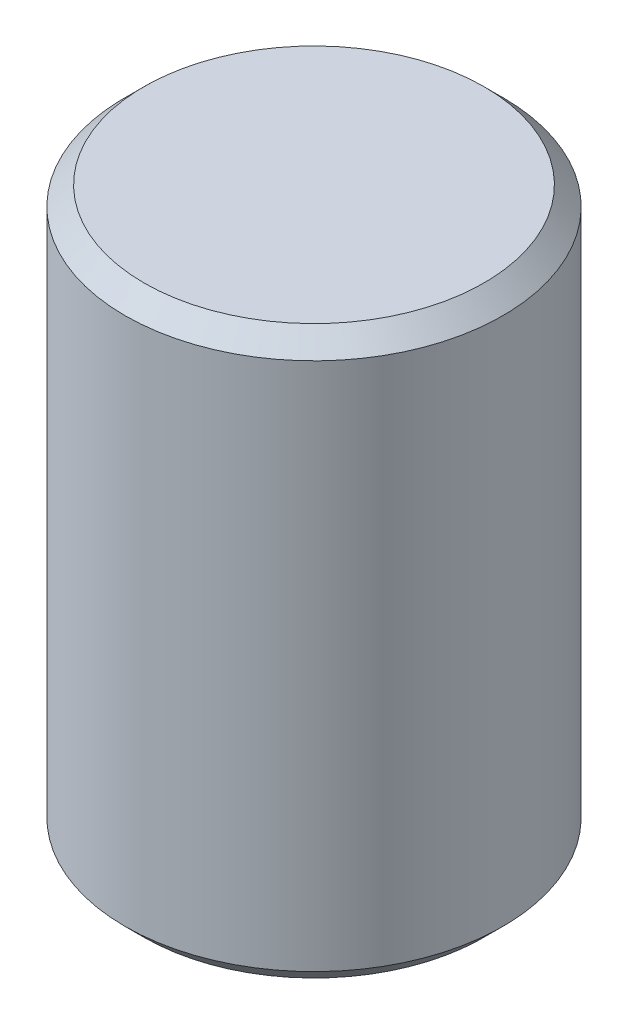
ISO-10303-21;
HEADER;
FILE_DESCRIPTION(('STEP AP214'),'2;1');
FILE_NAME('part.step','',(''),(''),'','','');
FILE_SCHEMA(('AUTOMOTIVE_DESIGN { 1 0 10303 214 1 1 1 1 }'));
ENDSEC;
DATA;
#1=APPLICATION_CONTEXT('core data for automotive mechanical design processes');
#2=APPLICATION_PROTOCOL_DEFINITION('international standard','automotive_design',2000,#1);
#3=PRODUCT_CONTEXT('',#1,'mechanical');
#4=PRODUCT('Part','Part','',(#3));
#5=PRODUCT_RELATED_PRODUCT_CATEGORY('part','',(#4));
#6=PRODUCT_DEFINITION_FORMATION('','',#4);
#7=PRODUCT_DEFINITION_CONTEXT('part definition',#1,'design');
#8=PRODUCT_DEFINITION('design','',#6,#7);
#9=PRODUCT_DEFINITION_SHAPE('','',#8);
#10=(LENGTH_UNIT() NAMED_UNIT(*) SI_UNIT(.MILLI.,.METRE.));
#11=(NAMED_UNIT(*) PLANE_ANGLE_UNIT() SI_UNIT($,.RADIAN.));
#12=(NAMED_UNIT(*) SI_UNIT($,.STERADIAN.) SOLID_ANGLE_UNIT());
#13=UNCERTAINTY_MEASURE_WITH_UNIT(LENGTH_MEASURE(1.E-05),#10,'distance_accuracy_value','');
#14=(GEOMETRIC_REPRESENTATION_CONTEXT(3) GLOBAL_UNCERTAINTY_ASSIGNED_CONTEXT((#13)) GLOBAL_UNIT_ASSIGNED_CONTEXT((#10,
#11,#12)) REPRESENTATION_CONTEXT('',''));
#15=CARTESIAN_POINT('',(0.,0.,0.));
#16=DIRECTION('',(0.,0.,1.));
#17=DIRECTION('',(1.,0.,0.));
#18=AXIS2_PLACEMENT_3D('',#15,#16,#17);
#19=CARTESIAN_POINT('',(-14.0149018484024,15.,-2.46428571428572));
#20=DIRECTION('',(0.,-1.,0.));
#21=DIRECTION('',(0.,0.,-1.));
#22=AXIS2_PLACEMENT_3D('',#19,#20,#21);
#23=CYLINDRICAL_SURFACE('',#22,5.);
#24=CARTESIAN_POINT('',(-14.0149018484024,0.499999999999999,-2.46428571428572));
#25=DIRECTION('',(0.,1.,0.));
#26=DIRECTION('',(0.,0.,1.));
#27=AXIS2_PLACEMENT_3D('',#24,#25,#26);
#28=CIRCLE('',#27,5.);
#29=CARTESIAN_POINT('',(-14.0149018484024,0.499999999999999,2.53571428571428));
#30=VERTEX_POINT('',#29);
#31=EDGE_CURVE('E51',#30,#30,#28,.T.);
#32=ORIENTED_EDGE('',*,*,#31,.T.);
#33=EDGE_LOOP('',(#32));
#34=FACE_BOUND('',#33,.T.);
#35=CARTESIAN_POINT('',(-14.0149018484024,14.5,-2.46428571428572));
#36=DIRECTION('',(0.,1.,0.));
#37=DIRECTION('',(0.,0.,1.));
#38=AXIS2_PLACEMENT_3D('',#35,#36,#37);
#39=CIRCLE('',#38,5.);
#40=CARTESIAN_POINT('',(-14.0149018484024,14.5,2.53571428571428));
#41=VERTEX_POINT('',#40);
#42=EDGE_CURVE('E54',#41,#41,#39,.F.);
#43=ORIENTED_EDGE('',*,*,#42,.T.);
#44=EDGE_LOOP('',(#43));
#45=FACE_BOUND('',#44,.T.);
#46=ADVANCED_FACE('F39',(#34,#45),#23,.T.);
#47=CARTESIAN_POINT('',(-14.0149018484024,15.,-2.46428571428572));
#48=DIRECTION('',(0.,1.,0.));
#49=DIRECTION('',(0.,0.,1.));
#50=AXIS2_PLACEMENT_3D('',#47,#48,#49);
#51=PLANE('',#50);
#52=CARTESIAN_POINT('',(-14.0149018484024,15.,-2.46428571428572));
#53=DIRECTION('',(0.,1.,0.));
#54=DIRECTION('',(0.,0.,1.));
#55=AXIS2_PLACEMENT_3D('',#52,#53,#54);
#56=CIRCLE('',#55,4.5);
#57=CARTESIAN_POINT('',(-14.0149018484024,15.,2.03571428571429));
#58=VERTEX_POINT('',#57);
#59=EDGE_CURVE('E10',#58,#58,#56,.T.);
#60=ORIENTED_EDGE('',*,*,#59,.T.);
#61=EDGE_LOOP('',(#60));
#62=FACE_BOUND('',#61,.T.);
#63=ADVANCED_FACE('F72',(#62),#51,.T.);
#64=CARTESIAN_POINT('',(-14.0149018484024,0.,-2.46428571428572));
#65=DIRECTION('',(0.,1.,0.));
#66=DIRECTION('',(0.,0.,1.));
#67=AXIS2_PLACEMENT_3D('',#64,#65,#66);
#68=PLANE('',#67);
#69=CARTESIAN_POINT('',(-14.0149018484024,0.,-2.46428571428572));
#70=DIRECTION('',(0.,1.,0.));
#71=DIRECTION('',(0.,0.,1.));
#72=AXIS2_PLACEMENT_3D('',#69,#70,#71);
#73=CIRCLE('',#72,4.5);
#74=CARTESIAN_POINT('',(-14.0149018484024,0.,2.03571428571428));
#75=VERTEX_POINT('',#74);
#76=EDGE_CURVE('E50',#75,#75,#73,.F.);
#77=ORIENTED_EDGE('',*,*,#76,.T.);
#78=EDGE_LOOP('',(#77));
#79=FACE_BOUND('',#78,.T.);
#80=ADVANCED_FACE('F66',(#79),#68,.F.);
#81=CARTESIAN_POINT('',(-14.0149018484024,0.499999999999999,-2.46428571428572));
#82=DIRECTION('',(0.,1.,0.));
#83=DIRECTION('',(0.,0.,1.));
#84=AXIS2_PLACEMENT_3D('',#81,#82,#83);
#85=CONICAL_SURFACE('',#84,5.,0.78539816339745);
#86=ORIENTED_EDGE('',*,*,#76,.F.);
#87=EDGE_LOOP('',(#86));
#88=FACE_BOUND('',#87,.T.);
#89=ORIENTED_EDGE('',*,*,#31,.F.);
#90=EDGE_LOOP('',(#89));
#91=FACE_BOUND('',#90,.T.);
#92=ADVANCED_FACE('F61',(#88,#91),#85,.T.);
#93=CARTESIAN_POINT('',(-14.0149018484024,15.,-2.46428571428572));
#94=DIRECTION('',(0.,-1.,0.));
#95=DIRECTION('',(0.,0.,-1.));
#96=AXIS2_PLACEMENT_3D('',#93,#94,#95);
#97=CONICAL_SURFACE('',#96,4.5,0.785398163397445);
#98=ORIENTED_EDGE('',*,*,#42,.F.);
#99=EDGE_LOOP('',(#98));
#100=FACE_BOUND('',#99,.T.);
#101=ORIENTED_EDGE('',*,*,#59,.F.);
#102=EDGE_LOOP('',(#101));
#103=FACE_BOUND('',#102,.T.);
#104=ADVANCED_FACE('F45',(#100,#103),#97,.T.);
#105=CLOSED_SHELL('',(#46,#63,#80,#92,#104));
#106=MANIFOLD_SOLID_BREP('B2',#105);
#107=ADVANCED_BREP_SHAPE_REPRESENTATION('',(#18,#106),#14);
#108=SHAPE_DEFINITION_REPRESENTATION(#9,#107);
ENDSEC;
END-ISO-10303-21;
